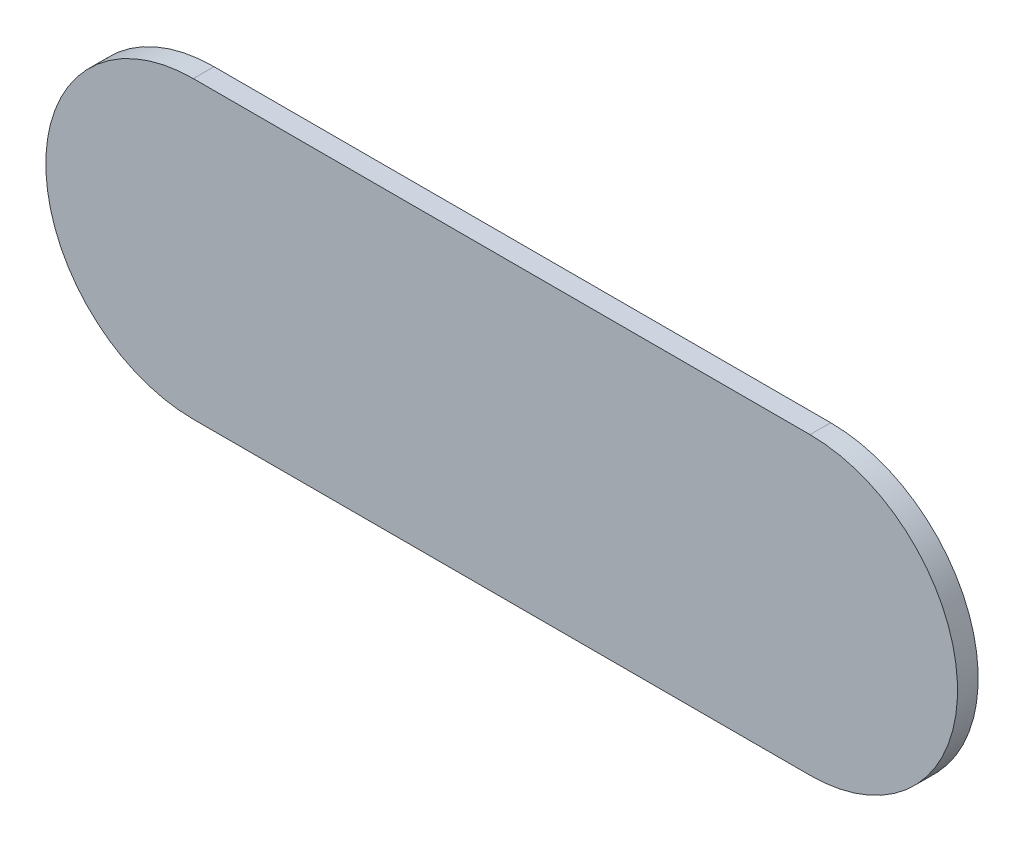
ISO-10303-21;
HEADER;
FILE_DESCRIPTION(('STEP AP214'),'2;1');
FILE_NAME('part.step','',(''),(''),'','','');
FILE_SCHEMA(('AUTOMOTIVE_DESIGN { 1 0 10303 214 1 1 1 1 }'));
ENDSEC;
DATA;
#1=APPLICATION_CONTEXT('core data for automotive mechanical design processes');
#2=APPLICATION_PROTOCOL_DEFINITION('international standard','automotive_design',2000,#1);
#3=PRODUCT_CONTEXT('',#1,'mechanical');
#4=PRODUCT('Part','Part','',(#3));
#5=PRODUCT_RELATED_PRODUCT_CATEGORY('part','',(#4));
#6=PRODUCT_DEFINITION_FORMATION('','',#4);
#7=PRODUCT_DEFINITION_CONTEXT('part definition',#1,'design');
#8=PRODUCT_DEFINITION('design','',#6,#7);
#9=PRODUCT_DEFINITION_SHAPE('','',#8);
#10=(LENGTH_UNIT() NAMED_UNIT(*) SI_UNIT(.MILLI.,.METRE.));
#11=(NAMED_UNIT(*) PLANE_ANGLE_UNIT() SI_UNIT($,.RADIAN.));
#12=(NAMED_UNIT(*) SI_UNIT($,.STERADIAN.) SOLID_ANGLE_UNIT());
#13=UNCERTAINTY_MEASURE_WITH_UNIT(LENGTH_MEASURE(1.E-05),#10,'distance_accuracy_value','');
#14=(GEOMETRIC_REPRESENTATION_CONTEXT(3) GLOBAL_UNCERTAINTY_ASSIGNED_CONTEXT((#13)) GLOBAL_UNIT_ASSIGNED_CONTEXT((#10,
#11,#12)) REPRESENTATION_CONTEXT('',''));
#15=CARTESIAN_POINT('',(0.,0.,0.));
#16=DIRECTION('',(0.,0.,1.));
#17=DIRECTION('',(1.,0.,0.));
#18=AXIS2_PLACEMENT_3D('',#15,#16,#17);
#19=CARTESIAN_POINT('',(90.745,-142.605,1.635));
#20=DIRECTION('',(0.,0.,1.));
#21=DIRECTION('',(1.,0.,0.));
#22=AXIS2_PLACEMENT_3D('',#19,#20,#21);
#23=PLANE('',#22);
#24=DIRECTION('',(-1.,0.,0.));
#25=VECTOR('',#24,1.);
#26=CARTESIAN_POINT('',(90.745,-142.605,1.635));
#27=LINE('',#26,#25);
#28=CARTESIAN_POINT('',(90.745,-142.605,1.635));
#29=VERTEX_POINT('',#28);
#30=CARTESIAN_POINT('',(89.7,-142.605,1.635));
#31=VERTEX_POINT('',#30);
#32=EDGE_CURVE('E89',#29,#31,#27,.T.);
#33=ORIENTED_EDGE('',*,*,#32,.T.);
#34=CARTESIAN_POINT('',(89.7,-142.855,1.635));
#35=DIRECTION('',(0.,0.,1.));
#36=DIRECTION('',(0.,1.,0.));
#37=AXIS2_PLACEMENT_3D('',#34,#35,#36);
#38=CIRCLE('',#37,0.25);
#39=CARTESIAN_POINT('',(89.7,-143.105,1.635));
#40=VERTEX_POINT('',#39);
#41=EDGE_CURVE('E110',#31,#40,#38,.T.);
#42=ORIENTED_EDGE('',*,*,#41,.T.);
#43=DIRECTION('',(1.,0.,0.));
#44=VECTOR('',#43,1.);
#45=CARTESIAN_POINT('',(89.7,-143.105,1.635));
#46=LINE('',#45,#44);
#47=CARTESIAN_POINT('',(90.745,-143.105,1.635));
#48=VERTEX_POINT('',#47);
#49=EDGE_CURVE('E50',#40,#48,#46,.T.);
#50=ORIENTED_EDGE('',*,*,#49,.T.);
#51=CARTESIAN_POINT('',(90.745,-142.855,1.635));
#52=DIRECTION('',(0.,0.,1.));
#53=DIRECTION('',(0.,-1.,0.));
#54=AXIS2_PLACEMENT_3D('',#51,#52,#53);
#55=CIRCLE('',#54,0.25);
#56=EDGE_CURVE('E11',#48,#29,#55,.T.);
#57=ORIENTED_EDGE('',*,*,#56,.T.);
#58=EDGE_LOOP('',(#33,#42,#50,#57));
#59=FACE_BOUND('',#58,.T.);
#60=ADVANCED_FACE('F17',(#59),#23,.T.);
#61=CARTESIAN_POINT('',(90.745,-142.605,1.6));
#62=DIRECTION('',(0.,0.,1.));
#63=DIRECTION('',(1.,0.,0.));
#64=AXIS2_PLACEMENT_3D('',#61,#62,#63);
#65=PLANE('',#64);
#66=CARTESIAN_POINT('',(90.745,-142.855,1.6));
#67=DIRECTION('',(0.,0.,1.));
#68=DIRECTION('',(0.,-1.,0.));
#69=AXIS2_PLACEMENT_3D('',#66,#67,#68);
#70=CIRCLE('',#69,0.25);
#71=CARTESIAN_POINT('',(90.745,-143.105,1.6));
#72=VERTEX_POINT('',#71);
#73=CARTESIAN_POINT('',(90.745,-142.605,1.6));
#74=VERTEX_POINT('',#73);
#75=EDGE_CURVE('E27',#72,#74,#70,.T.);
#76=ORIENTED_EDGE('',*,*,#75,.F.);
#77=DIRECTION('',(1.,0.,0.));
#78=VECTOR('',#77,1.);
#79=CARTESIAN_POINT('',(89.7,-143.105,1.6));
#80=LINE('',#79,#78);
#81=CARTESIAN_POINT('',(89.7,-143.105,1.6));
#82=VERTEX_POINT('',#81);
#83=EDGE_CURVE('E59',#82,#72,#80,.T.);
#84=ORIENTED_EDGE('',*,*,#83,.F.);
#85=CARTESIAN_POINT('',(89.7,-142.855,1.6));
#86=DIRECTION('',(0.,0.,1.));
#87=DIRECTION('',(0.,1.,0.));
#88=AXIS2_PLACEMENT_3D('',#85,#86,#87);
#89=CIRCLE('',#88,0.25);
#90=CARTESIAN_POINT('',(89.7,-142.605,1.6));
#91=VERTEX_POINT('',#90);
#92=EDGE_CURVE('E91',#91,#82,#89,.T.);
#93=ORIENTED_EDGE('',*,*,#92,.F.);
#94=DIRECTION('',(-1.,0.,0.));
#95=VECTOR('',#94,1.);
#96=CARTESIAN_POINT('',(90.745,-142.605,1.6));
#97=LINE('',#96,#95);
#98=EDGE_CURVE('E88',#74,#91,#97,.T.);
#99=ORIENTED_EDGE('',*,*,#98,.F.);
#100=EDGE_LOOP('',(#76,#84,#93,#99));
#101=FACE_BOUND('',#100,.T.);
#102=ADVANCED_FACE('F19',(#101),#65,.F.);
#103=CARTESIAN_POINT('',(90.745,-142.855,1.6));
#104=DIRECTION('',(0.,0.,-1.));
#105=DIRECTION('',(0.,-1.,0.));
#106=AXIS2_PLACEMENT_3D('',#103,#104,#105);
#107=CYLINDRICAL_SURFACE('',#106,0.25);
#108=ORIENTED_EDGE('',*,*,#75,.T.);
#109=DIRECTION('',(0.,0.,1.));
#110=VECTOR('',#109,1.);
#111=CARTESIAN_POINT('',(90.745,-142.605,1.6));
#112=LINE('',#111,#110);
#113=EDGE_CURVE('E78',#74,#29,#112,.T.);
#114=ORIENTED_EDGE('',*,*,#113,.T.);
#115=ORIENTED_EDGE('',*,*,#56,.F.);
#116=DIRECTION('',(0.,0.,1.));
#117=VECTOR('',#116,1.);
#118=CARTESIAN_POINT('',(90.745,-143.105,1.6));
#119=LINE('',#118,#117);
#120=EDGE_CURVE('E80',#72,#48,#119,.T.);
#121=ORIENTED_EDGE('',*,*,#120,.F.);
#122=EDGE_LOOP('',(#108,#114,#115,#121));
#123=FACE_BOUND('',#122,.T.);
#124=ADVANCED_FACE('F77',(#123),#107,.T.);
#125=CARTESIAN_POINT('',(89.7,-143.105,1.6));
#126=DIRECTION('',(0.,1.,0.));
#127=DIRECTION('',(1.,0.,0.));
#128=AXIS2_PLACEMENT_3D('',#125,#126,#127);
#129=PLANE('',#128);
#130=ORIENTED_EDGE('',*,*,#83,.T.);
#131=ORIENTED_EDGE('',*,*,#120,.T.);
#132=ORIENTED_EDGE('',*,*,#49,.F.);
#133=DIRECTION('',(0.,0.,1.));
#134=VECTOR('',#133,1.);
#135=CARTESIAN_POINT('',(89.7,-143.105,1.6));
#136=LINE('',#135,#134);
#137=EDGE_CURVE('E106',#82,#40,#136,.T.);
#138=ORIENTED_EDGE('',*,*,#137,.F.);
#139=EDGE_LOOP('',(#130,#131,#132,#138));
#140=FACE_BOUND('',#139,.T.);
#141=ADVANCED_FACE('F123',(#140),#129,.F.);
#142=CARTESIAN_POINT('',(89.7,-142.855,1.6));
#143=DIRECTION('',(0.,0.,-1.));
#144=DIRECTION('',(0.,1.,0.));
#145=AXIS2_PLACEMENT_3D('',#142,#143,#144);
#146=CYLINDRICAL_SURFACE('',#145,0.25);
#147=ORIENTED_EDGE('',*,*,#92,.T.);
#148=ORIENTED_EDGE('',*,*,#137,.T.);
#149=ORIENTED_EDGE('',*,*,#41,.F.);
#150=DIRECTION('',(0.,0.,1.));
#151=VECTOR('',#150,1.);
#152=CARTESIAN_POINT('',(89.7,-142.605,1.6));
#153=LINE('',#152,#151);
#154=EDGE_CURVE('E96',#91,#31,#153,.T.);
#155=ORIENTED_EDGE('',*,*,#154,.F.);
#156=EDGE_LOOP('',(#147,#148,#149,#155));
#157=FACE_BOUND('',#156,.T.);
#158=ADVANCED_FACE('F125',(#157),#146,.T.);
#159=CARTESIAN_POINT('',(90.745,-142.605,1.6));
#160=DIRECTION('',(0.,-1.,0.));
#161=DIRECTION('',(0.,0.,-1.));
#162=AXIS2_PLACEMENT_3D('',#159,#160,#161);
#163=PLANE('',#162);
#164=ORIENTED_EDGE('',*,*,#98,.T.);
#165=ORIENTED_EDGE('',*,*,#154,.T.);
#166=ORIENTED_EDGE('',*,*,#32,.F.);
#167=ORIENTED_EDGE('',*,*,#113,.F.);
#168=EDGE_LOOP('',(#164,#165,#166,#167));
#169=FACE_BOUND('',#168,.T.);
#170=ADVANCED_FACE('F86',(#169),#163,.F.);
#171=CLOSED_SHELL('',(#60,#102,#124,#141,#158,#170));
#172=MANIFOLD_SOLID_BREP('B1',#171);
#173=ADVANCED_BREP_SHAPE_REPRESENTATION('',(#18,#172),#14);
#174=SHAPE_DEFINITION_REPRESENTATION(#9,#173);
ENDSEC;
END-ISO-10303-21;
